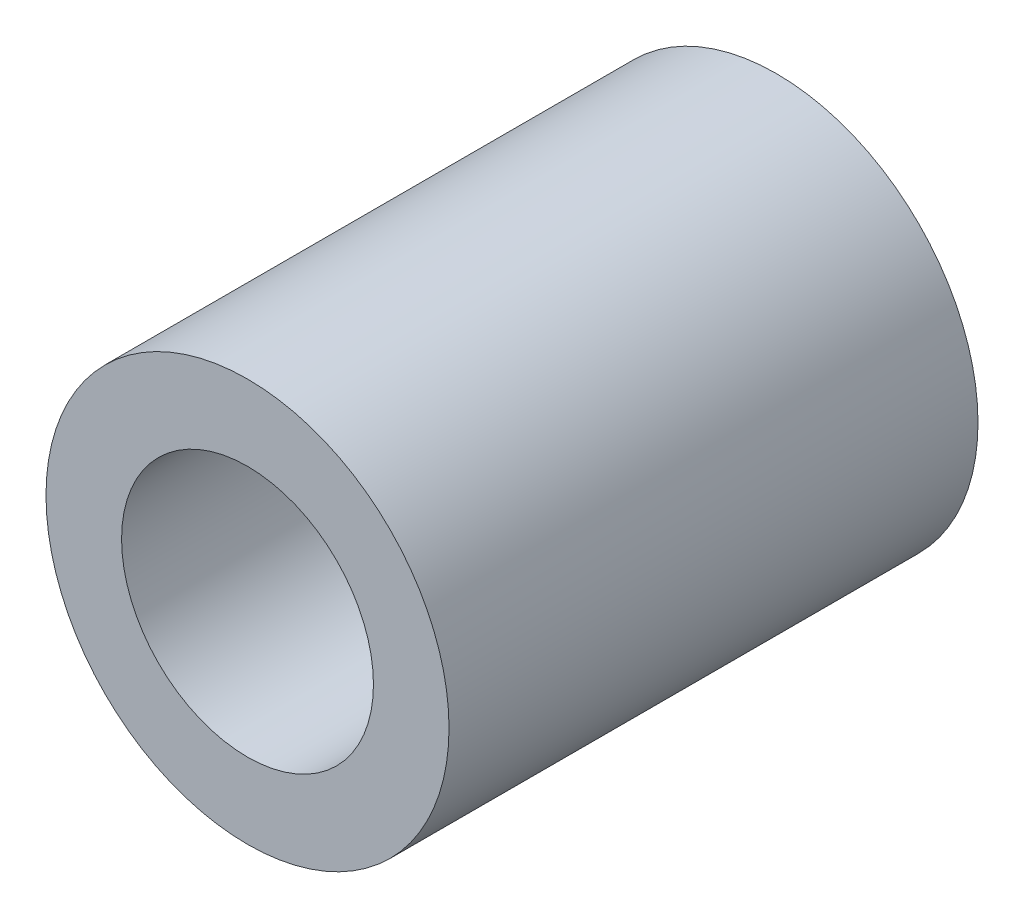
ISO-10303-21;
HEADER;
FILE_DESCRIPTION(('STEP AP214'),'2;1');
FILE_NAME('part.step','',(''),(''),'','','');
FILE_SCHEMA(('AUTOMOTIVE_DESIGN { 1 0 10303 214 1 1 1 1 }'));
ENDSEC;
DATA;
#1=APPLICATION_CONTEXT('core data for automotive mechanical design processes');
#2=APPLICATION_PROTOCOL_DEFINITION('international standard','automotive_design',2000,#1);
#3=PRODUCT_CONTEXT('',#1,'mechanical');
#4=PRODUCT('Part','Part','',(#3));
#5=PRODUCT_RELATED_PRODUCT_CATEGORY('part','',(#4));
#6=PRODUCT_DEFINITION_FORMATION('','',#4);
#7=PRODUCT_DEFINITION_CONTEXT('part definition',#1,'design');
#8=PRODUCT_DEFINITION('design','',#6,#7);
#9=PRODUCT_DEFINITION_SHAPE('','',#8);
#10=(LENGTH_UNIT() NAMED_UNIT(*) SI_UNIT(.MILLI.,.METRE.));
#11=(NAMED_UNIT(*) PLANE_ANGLE_UNIT() SI_UNIT($,.RADIAN.));
#12=(NAMED_UNIT(*) SI_UNIT($,.STERADIAN.) SOLID_ANGLE_UNIT());
#13=UNCERTAINTY_MEASURE_WITH_UNIT(LENGTH_MEASURE(1.E-05),#10,'distance_accuracy_value','');
#14=(GEOMETRIC_REPRESENTATION_CONTEXT(3) GLOBAL_UNCERTAINTY_ASSIGNED_CONTEXT((#13)) GLOBAL_UNIT_ASSIGNED_CONTEXT((#10,
#11,#12)) REPRESENTATION_CONTEXT('',''));
#15=CARTESIAN_POINT('',(0.,0.,0.));
#16=DIRECTION('',(0.,0.,1.));
#17=DIRECTION('',(1.,0.,0.));
#18=AXIS2_PLACEMENT_3D('',#15,#16,#17);
#19=CARTESIAN_POINT('',(0.,0.,21.));
#20=DIRECTION('',(0.,0.,1.));
#21=DIRECTION('',(1.,0.,0.));
#22=AXIS2_PLACEMENT_3D('',#19,#20,#21);
#23=PLANE('',#22);
#24=CARTESIAN_POINT('',(0.,0.,21.));
#25=DIRECTION('',(0.,0.,1.));
#26=DIRECTION('',(1.,0.,0.));
#27=AXIS2_PLACEMENT_3D('',#24,#25,#26);
#28=CIRCLE('',#27,16.);
#29=CARTESIAN_POINT('',(-16.,0.,21.));
#30=VERTEX_POINT('',#29);
#31=EDGE_CURVE('E10',#30,#30,#28,.T.);
#32=ORIENTED_EDGE('',*,*,#31,.T.);
#33=EDGE_LOOP('',(#32));
#34=FACE_BOUND('',#33,.T.);
#35=CARTESIAN_POINT('',(0.,0.,21.));
#36=DIRECTION('',(0.,0.,1.));
#37=DIRECTION('',(1.,0.,0.));
#38=AXIS2_PLACEMENT_3D('',#35,#36,#37);
#39=CIRCLE('',#38,10.);
#40=CARTESIAN_POINT('',(-10.,0.,21.));
#41=VERTEX_POINT('',#40);
#42=EDGE_CURVE('E41',#41,#41,#39,.T.);
#43=ORIENTED_EDGE('',*,*,#42,.F.);
#44=EDGE_LOOP('',(#43));
#45=FACE_BOUND('',#44,.T.);
#46=ADVANCED_FACE('F30',(#34,#45),#23,.T.);
#47=CARTESIAN_POINT('',(0.,0.,-21.));
#48=DIRECTION('',(0.,0.,1.));
#49=DIRECTION('',(1.,0.,0.));
#50=AXIS2_PLACEMENT_3D('',#47,#48,#49);
#51=PLANE('',#50);
#52=CARTESIAN_POINT('',(0.,0.,-21.));
#53=DIRECTION('',(0.,0.,1.));
#54=DIRECTION('',(1.,0.,0.));
#55=AXIS2_PLACEMENT_3D('',#52,#53,#54);
#56=CIRCLE('',#55,16.);
#57=CARTESIAN_POINT('',(-16.,0.,-21.));
#58=VERTEX_POINT('',#57);
#59=EDGE_CURVE('E34',#58,#58,#56,.T.);
#60=ORIENTED_EDGE('',*,*,#59,.F.);
#61=EDGE_LOOP('',(#60));
#62=FACE_BOUND('',#61,.T.);
#63=CARTESIAN_POINT('',(0.,0.,-21.));
#64=DIRECTION('',(0.,0.,1.));
#65=DIRECTION('',(1.,0.,0.));
#66=AXIS2_PLACEMENT_3D('',#63,#64,#65);
#67=CIRCLE('',#66,10.);
#68=CARTESIAN_POINT('',(-10.,0.,-21.));
#69=VERTEX_POINT('',#68);
#70=EDGE_CURVE('E43',#69,#69,#67,.T.);
#71=ORIENTED_EDGE('',*,*,#70,.T.);
#72=EDGE_LOOP('',(#71));
#73=FACE_BOUND('',#72,.T.);
#74=ADVANCED_FACE('F53',(#62,#73),#51,.F.);
#75=CARTESIAN_POINT('',(0.,0.,21.));
#76=DIRECTION('',(0.,0.,-1.));
#77=DIRECTION('',(-1.,0.,0.));
#78=AXIS2_PLACEMENT_3D('',#75,#76,#77);
#79=CYLINDRICAL_SURFACE('',#78,16.);
#80=CARTESIAN_POINT('',(-16.,0.,21.));
#81=CARTESIAN_POINT('',(-16.,0.,20.5625));
#82=CARTESIAN_POINT('',(-16.,0.,20.125));
#83=CARTESIAN_POINT('',(-16.,0.,19.25));
#84=CARTESIAN_POINT('',(-16.,0.,18.8125));
#85=CARTESIAN_POINT('',(-16.,0.,17.9375));
#86=CARTESIAN_POINT('',(-16.,0.,17.5));
#87=CARTESIAN_POINT('',(-16.,0.,16.625));
#88=CARTESIAN_POINT('',(-16.,0.,16.1875));
#89=CARTESIAN_POINT('',(-16.,0.,15.3125));
#90=CARTESIAN_POINT('',(-16.,0.,14.875));
#91=CARTESIAN_POINT('',(-16.,0.,14.));
#92=CARTESIAN_POINT('',(-16.,0.,13.5625));
#93=CARTESIAN_POINT('',(-16.,0.,12.6875));
#94=CARTESIAN_POINT('',(-16.,0.,12.25));
#95=CARTESIAN_POINT('',(-16.,0.,11.375));
#96=CARTESIAN_POINT('',(-16.,0.,10.9375));
#97=CARTESIAN_POINT('',(-16.,0.,10.0625));
#98=CARTESIAN_POINT('',(-16.,0.,9.625));
#99=CARTESIAN_POINT('',(-16.,0.,8.75));
#100=CARTESIAN_POINT('',(-16.,0.,8.3125));
#101=CARTESIAN_POINT('',(-16.,0.,7.4375));
#102=CARTESIAN_POINT('',(-16.,0.,7.));
#103=CARTESIAN_POINT('',(-16.,0.,6.125));
#104=CARTESIAN_POINT('',(-16.,0.,5.6875));
#105=CARTESIAN_POINT('',(-16.,0.,4.8125));
#106=CARTESIAN_POINT('',(-16.,0.,4.375));
#107=CARTESIAN_POINT('',(-16.,0.,3.5));
#108=CARTESIAN_POINT('',(-16.,0.,3.0625));
#109=CARTESIAN_POINT('',(-16.,0.,2.1875));
#110=CARTESIAN_POINT('',(-16.,0.,1.75));
#111=CARTESIAN_POINT('',(-16.,0.,0.874999999999997));
#112=CARTESIAN_POINT('',(-16.,0.,0.437499999999997));
#113=CARTESIAN_POINT('',(-16.,0.,-0.437500000000004));
#114=CARTESIAN_POINT('',(-16.,0.,-0.875000000000004));
#115=CARTESIAN_POINT('',(-16.,0.,-1.75000000000001));
#116=CARTESIAN_POINT('',(-16.,0.,-2.18750000000001));
#117=CARTESIAN_POINT('',(-16.,0.,-3.0625));
#118=CARTESIAN_POINT('',(-16.,0.,-3.5));
#119=CARTESIAN_POINT('',(-16.,0.,-4.375));
#120=CARTESIAN_POINT('',(-16.,0.,-4.8125));
#121=CARTESIAN_POINT('',(-16.,0.,-5.68750000000001));
#122=CARTESIAN_POINT('',(-16.,0.,-6.12500000000001));
#123=CARTESIAN_POINT('',(-16.,0.,-7.00000000000001));
#124=CARTESIAN_POINT('',(-16.,0.,-7.4375));
#125=CARTESIAN_POINT('',(-16.,0.,-8.3125));
#126=CARTESIAN_POINT('',(-16.,0.,-8.75));
#127=CARTESIAN_POINT('',(-16.,0.,-9.625));
#128=CARTESIAN_POINT('',(-16.,0.,-10.0625));
#129=CARTESIAN_POINT('',(-16.,0.,-10.9375));
#130=CARTESIAN_POINT('',(-16.,0.,-11.375));
#131=CARTESIAN_POINT('',(-16.,0.,-12.25));
#132=CARTESIAN_POINT('',(-16.,0.,-12.6875));
#133=CARTESIAN_POINT('',(-16.,0.,-13.5625));
#134=CARTESIAN_POINT('',(-16.,0.,-14.));
#135=CARTESIAN_POINT('',(-16.,0.,-14.875));
#136=CARTESIAN_POINT('',(-16.,0.,-15.3125));
#137=CARTESIAN_POINT('',(-16.,0.,-16.1875));
#138=CARTESIAN_POINT('',(-16.,0.,-16.625));
#139=CARTESIAN_POINT('',(-16.,0.,-17.5));
#140=CARTESIAN_POINT('',(-16.,0.,-17.9375));
#141=CARTESIAN_POINT('',(-16.,0.,-18.8125));
#142=CARTESIAN_POINT('',(-16.,0.,-19.25));
#143=CARTESIAN_POINT('',(-16.,0.,-20.125));
#144=CARTESIAN_POINT('',(-16.,0.,-20.5625));
#145=CARTESIAN_POINT('',(-16.,0.,-21.));
#146=B_SPLINE_CURVE_WITH_KNOTS('',3,(#80,#81,#82,#83,#84,#85,#86,#87,#88,#89,#90,#91,#92,#93,
#94,#95,#96,#97,#98,#99,#100,#101,#102,#103,#104,#105,#106,#107,#108,#109,#110,#111,#112,#113,
#114,#115,#116,#117,#118,#119,#120,#121,#122,#123,#124,#125,#126,#127,#128,#129,#130,#131,#132,
#133,#134,#135,#136,#137,#138,#139,#140,#141,#142,#143,#144,#145),.UNSPECIFIED.,.F.,.F.,(4,2,2,
2,2,2,2,2,2,2,2,2,2,2,2,2,2,2,2,2,2,2,2,2,2,2,2,2,2,2,2,2,4),(0.,1.3125,2.625,3.9375,5.25,
6.5625,7.875,9.1875,10.5,11.8125,13.125,14.4375,15.75,17.0625,18.375,19.6875,21.,22.3125,23.625,
24.9375,26.25,27.5625,28.875,30.1875,31.5,32.8125,34.125,35.4375,36.75,38.0625,39.375,40.6875,
42.),.UNSPECIFIED.);
#147=EDGE_CURVE('BSEAM32',#30,#58,#146,.T.);
#148=ORIENTED_EDGE('',*,*,#31,.F.);
#149=ORIENTED_EDGE('',*,*,#59,.T.);
#150=ORIENTED_EDGE('',*,*,#147,.T.);
#151=ORIENTED_EDGE('',*,*,#147,.F.);
#152=EDGE_LOOP('',(#148,#150,#149,#151));
#153=FACE_BOUND('',#152,.T.);
#154=ADVANCED_FACE('F32',(#153),#79,.T.);
#155=CARTESIAN_POINT('',(0.,0.,21.));
#156=DIRECTION('',(0.,0.,-1.));
#157=DIRECTION('',(-1.,0.,0.));
#158=AXIS2_PLACEMENT_3D('',#155,#156,#157);
#159=CYLINDRICAL_SURFACE('',#158,10.);
#160=CARTESIAN_POINT('',(-10.,0.,21.));
#161=CARTESIAN_POINT('',(-10.,0.,20.5625));
#162=CARTESIAN_POINT('',(-10.,0.,20.125));
#163=CARTESIAN_POINT('',(-10.,0.,19.25));
#164=CARTESIAN_POINT('',(-10.,0.,18.8125));
#165=CARTESIAN_POINT('',(-10.,0.,17.9375));
#166=CARTESIAN_POINT('',(-10.,0.,17.5));
#167=CARTESIAN_POINT('',(-10.,0.,16.625));
#168=CARTESIAN_POINT('',(-10.,0.,16.1875));
#169=CARTESIAN_POINT('',(-10.,0.,15.3125));
#170=CARTESIAN_POINT('',(-10.,0.,14.875));
#171=CARTESIAN_POINT('',(-10.,0.,14.));
#172=CARTESIAN_POINT('',(-10.,0.,13.5625));
#173=CARTESIAN_POINT('',(-10.,0.,12.6875));
#174=CARTESIAN_POINT('',(-10.,0.,12.25));
#175=CARTESIAN_POINT('',(-10.,0.,11.375));
#176=CARTESIAN_POINT('',(-10.,0.,10.9375));
#177=CARTESIAN_POINT('',(-10.,0.,10.0625));
#178=CARTESIAN_POINT('',(-10.,0.,9.625));
#179=CARTESIAN_POINT('',(-10.,0.,8.75));
#180=CARTESIAN_POINT('',(-10.,0.,8.3125));
#181=CARTESIAN_POINT('',(-10.,0.,7.4375));
#182=CARTESIAN_POINT('',(-10.,0.,7.));
#183=CARTESIAN_POINT('',(-10.,0.,6.125));
#184=CARTESIAN_POINT('',(-10.,0.,5.6875));
#185=CARTESIAN_POINT('',(-10.,0.,4.8125));
#186=CARTESIAN_POINT('',(-10.,0.,4.375));
#187=CARTESIAN_POINT('',(-10.,0.,3.5));
#188=CARTESIAN_POINT('',(-10.,0.,3.0625));
#189=CARTESIAN_POINT('',(-10.,0.,2.1875));
#190=CARTESIAN_POINT('',(-10.,0.,1.75));
#191=CARTESIAN_POINT('',(-10.,0.,0.874999999999997));
#192=CARTESIAN_POINT('',(-10.,0.,0.437499999999997));
#193=CARTESIAN_POINT('',(-10.,0.,-0.437500000000004));
#194=CARTESIAN_POINT('',(-10.,0.,-0.875000000000004));
#195=CARTESIAN_POINT('',(-10.,0.,-1.75000000000001));
#196=CARTESIAN_POINT('',(-10.,0.,-2.18750000000001));
#197=CARTESIAN_POINT('',(-10.,0.,-3.0625));
#198=CARTESIAN_POINT('',(-10.,0.,-3.5));
#199=CARTESIAN_POINT('',(-10.,0.,-4.375));
#200=CARTESIAN_POINT('',(-10.,0.,-4.8125));
#201=CARTESIAN_POINT('',(-10.,0.,-5.68750000000001));
#202=CARTESIAN_POINT('',(-10.,0.,-6.12500000000001));
#203=CARTESIAN_POINT('',(-10.,0.,-7.00000000000001));
#204=CARTESIAN_POINT('',(-10.,0.,-7.4375));
#205=CARTESIAN_POINT('',(-10.,0.,-8.3125));
#206=CARTESIAN_POINT('',(-10.,0.,-8.75));
#207=CARTESIAN_POINT('',(-10.,0.,-9.625));
#208=CARTESIAN_POINT('',(-10.,0.,-10.0625));
#209=CARTESIAN_POINT('',(-10.,0.,-10.9375));
#210=CARTESIAN_POINT('',(-10.,0.,-11.375));
#211=CARTESIAN_POINT('',(-10.,0.,-12.25));
#212=CARTESIAN_POINT('',(-10.,0.,-12.6875));
#213=CARTESIAN_POINT('',(-10.,0.,-13.5625));
#214=CARTESIAN_POINT('',(-10.,0.,-14.));
#215=CARTESIAN_POINT('',(-10.,0.,-14.875));
#216=CARTESIAN_POINT('',(-10.,0.,-15.3125));
#217=CARTESIAN_POINT('',(-10.,0.,-16.1875));
#218=CARTESIAN_POINT('',(-10.,0.,-16.625));
#219=CARTESIAN_POINT('',(-10.,0.,-17.5));
#220=CARTESIAN_POINT('',(-10.,0.,-17.9375));
#221=CARTESIAN_POINT('',(-10.,0.,-18.8125));
#222=CARTESIAN_POINT('',(-10.,0.,-19.25));
#223=CARTESIAN_POINT('',(-10.,0.,-20.125));
#224=CARTESIAN_POINT('',(-10.,0.,-20.5625));
#225=CARTESIAN_POINT('',(-10.,0.,-21.));
#226=B_SPLINE_CURVE_WITH_KNOTS('',3,(#160,#161,#162,#163,#164,#165,#166,#167,#168,#169,#170,
#171,#172,#173,#174,#175,#176,#177,#178,#179,#180,#181,#182,#183,#184,#185,#186,#187,#188,#189,
#190,#191,#192,#193,#194,#195,#196,#197,#198,#199,#200,#201,#202,#203,#204,#205,#206,#207,#208,
#209,#210,#211,#212,#213,#214,#215,#216,#217,#218,#219,#220,#221,#222,#223,#224,#225),
.UNSPECIFIED.,.F.,.F.,(4,2,2,2,2,2,2,2,2,2,2,2,2,2,2,2,2,2,2,2,2,2,2,2,2,2,2,2,2,2,2,2,4),(0.,
1.3125,2.625,3.9375,5.25,6.5625,7.875,9.1875,10.5,11.8125,13.125,14.4375,15.75,17.0625,18.375,
19.6875,21.,22.3125,23.625,24.9375,26.25,27.5625,28.875,30.1875,31.5,32.8125,34.125,35.4375,
36.75,38.0625,39.375,40.6875,42.),.UNSPECIFIED.);
#227=EDGE_CURVE('BSEAM49',#41,#69,#226,.T.);
#228=ORIENTED_EDGE('',*,*,#42,.T.);
#229=ORIENTED_EDGE('',*,*,#70,.F.);
#230=ORIENTED_EDGE('',*,*,#227,.T.);
#231=ORIENTED_EDGE('',*,*,#227,.F.);
#232=EDGE_LOOP('',(#228,#230,#229,#231));
#233=FACE_BOUND('',#232,.T.);
#234=ADVANCED_FACE('F49',(#233),#159,.F.);
#235=CLOSED_SHELL('',(#46,#74,#154,#234));
#236=MANIFOLD_SOLID_BREP('B2',#235);
#237=ADVANCED_BREP_SHAPE_REPRESENTATION('',(#18,#236),#14);
#238=SHAPE_DEFINITION_REPRESENTATION(#9,#237);
ENDSEC;
END-ISO-10303-21;
